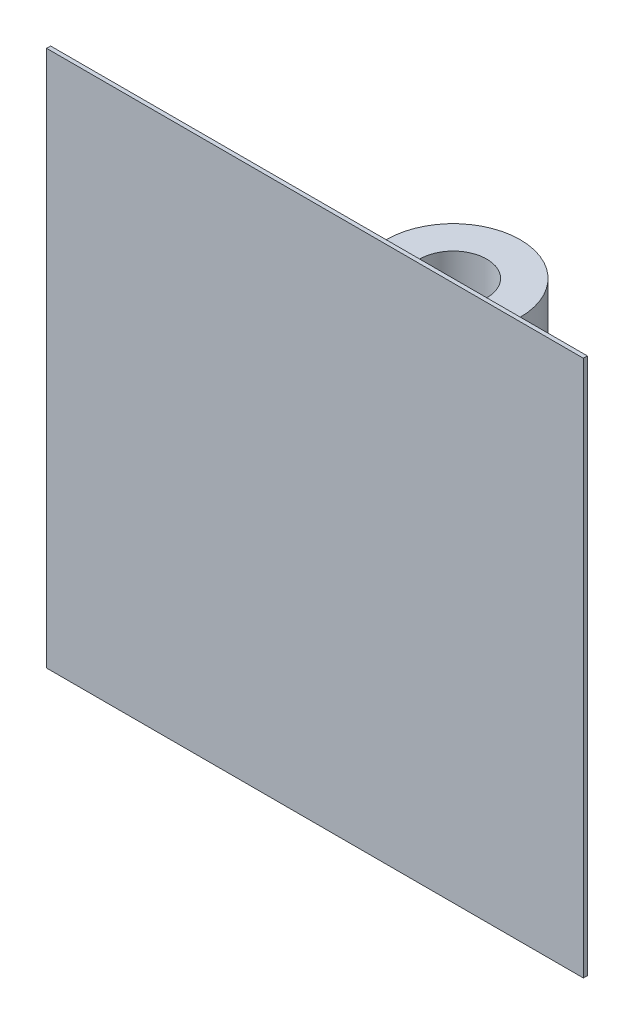
ISO-10303-21;
HEADER;
FILE_DESCRIPTION(('STEP AP214'),'2;1');
FILE_NAME('part.step','',(''),(''),'','','');
FILE_SCHEMA(('AUTOMOTIVE_DESIGN { 1 0 10303 214 1 1 1 1 }'));
ENDSEC;
DATA;
#1=APPLICATION_CONTEXT('core data for automotive mechanical design processes');
#2=APPLICATION_PROTOCOL_DEFINITION('international standard','automotive_design',2000,#1);
#3=PRODUCT_CONTEXT('',#1,'mechanical');
#4=PRODUCT('Part','Part','',(#3));
#5=PRODUCT_RELATED_PRODUCT_CATEGORY('part','',(#4));
#6=PRODUCT_DEFINITION_FORMATION('','',#4);
#7=PRODUCT_DEFINITION_CONTEXT('part definition',#1,'design');
#8=PRODUCT_DEFINITION('design','',#6,#7);
#9=PRODUCT_DEFINITION_SHAPE('','',#8);
#10=(LENGTH_UNIT() NAMED_UNIT(*) SI_UNIT(.MILLI.,.METRE.));
#11=(NAMED_UNIT(*) PLANE_ANGLE_UNIT() SI_UNIT($,.RADIAN.));
#12=(NAMED_UNIT(*) SI_UNIT($,.STERADIAN.) SOLID_ANGLE_UNIT());
#13=UNCERTAINTY_MEASURE_WITH_UNIT(LENGTH_MEASURE(1.E-05),#10,'distance_accuracy_value','');
#14=(GEOMETRIC_REPRESENTATION_CONTEXT(3) GLOBAL_UNCERTAINTY_ASSIGNED_CONTEXT((#13)) GLOBAL_UNIT_ASSIGNED_CONTEXT((#10,
#11,#12)) REPRESENTATION_CONTEXT('',''));
#15=CARTESIAN_POINT('',(0.,0.,0.));
#16=DIRECTION('',(0.,0.,1.));
#17=DIRECTION('',(1.,0.,0.));
#18=AXIS2_PLACEMENT_3D('',#15,#16,#17);
#19=CARTESIAN_POINT('',(0.,-10.,-10.));
#20=DIRECTION('',(0.,1.,0.));
#21=DIRECTION('',(0.,0.,1.));
#22=AXIS2_PLACEMENT_3D('',#19,#20,#21);
#23=CYLINDRICAL_SURFACE('',#22,5.);
#24=DIRECTION('',(0.,1.,0.));
#25=VECTOR('',#24,1.);
#26=CARTESIAN_POINT('',(-5.,-10.,-10.));
#27=LINE('',#26,#25);
#28=CARTESIAN_POINT('',(-5.,-10.,-10.));
#29=VERTEX_POINT('',#28);
#30=CARTESIAN_POINT('',(-5.,-2.5,-10.));
#31=VERTEX_POINT('',#30);
#32=EDGE_CURVE('E195',#29,#31,#27,.T.);
#33=ORIENTED_EDGE('',*,*,#32,.T.);
#34=CARTESIAN_POINT('',(0.,-2.5,-10.));
#35=DIRECTION('',(0.,1.,0.));
#36=DIRECTION('',(0.,0.,1.));
#37=AXIS2_PLACEMENT_3D('',#34,#35,#36);
#38=CIRCLE('',#37,5.);
#39=CARTESIAN_POINT('',(5.,-2.5,-10.));
#40=VERTEX_POINT('',#39);
#41=EDGE_CURVE('E49',#31,#40,#38,.F.);
#42=ORIENTED_EDGE('',*,*,#41,.T.);
#43=DIRECTION('',(0.,1.,0.));
#44=VECTOR('',#43,1.);
#45=CARTESIAN_POINT('',(5.,-10.,-10.));
#46=LINE('',#45,#44);
#47=CARTESIAN_POINT('',(5.,-10.,-10.));
#48=VERTEX_POINT('',#47);
#49=EDGE_CURVE('E185',#48,#40,#46,.T.);
#50=ORIENTED_EDGE('',*,*,#49,.F.);
#51=CARTESIAN_POINT('',(0.,-10.,-10.));
#52=DIRECTION('',(0.,1.,0.));
#53=DIRECTION('',(0.,0.,1.));
#54=AXIS2_PLACEMENT_3D('',#51,#52,#53);
#55=CIRCLE('',#54,5.);
#56=EDGE_CURVE('E173',#48,#29,#55,.T.);
#57=ORIENTED_EDGE('',*,*,#56,.T.);
#58=EDGE_LOOP('',(#33,#42,#50,#57));
#59=FACE_BOUND('',#58,.T.);
#60=ADVANCED_FACE('F34',(#59),#23,.T.);
#61=CARTESIAN_POINT('',(0.,-10.,-10.));
#62=DIRECTION('',(0.,1.,0.));
#63=DIRECTION('',(0.,0.,1.));
#64=AXIS2_PLACEMENT_3D('',#61,#62,#63);
#65=CYLINDRICAL_SURFACE('',#64,2.5);
#66=CARTESIAN_POINT('',(0.,-10.,-10.));
#67=DIRECTION('',(0.,1.,0.));
#68=DIRECTION('',(0.,0.,1.));
#69=AXIS2_PLACEMENT_3D('',#66,#67,#68);
#70=CIRCLE('',#69,2.5);
#71=CARTESIAN_POINT('',(0.,-10.,-7.5));
#72=VERTEX_POINT('',#71);
#73=EDGE_CURVE('E170',#72,#72,#70,.T.);
#74=ORIENTED_EDGE('',*,*,#73,.F.);
#75=EDGE_LOOP('',(#74));
#76=FACE_BOUND('',#75,.T.);
#77=CARTESIAN_POINT('',(0.,-2.5,-10.));
#78=DIRECTION('',(0.,1.,0.));
#79=DIRECTION('',(0.,0.,1.));
#80=AXIS2_PLACEMENT_3D('',#77,#78,#79);
#81=CIRCLE('',#80,2.5);
#82=CARTESIAN_POINT('',(0.,-2.5,-7.5));
#83=VERTEX_POINT('',#82);
#84=EDGE_CURVE('E130',#83,#83,#81,.F.);
#85=ORIENTED_EDGE('',*,*,#84,.F.);
#86=EDGE_LOOP('',(#85));
#87=FACE_BOUND('',#86,.T.);
#88=ADVANCED_FACE('F260',(#76,#87),#65,.F.);
#89=CARTESIAN_POINT('',(0.,0.,0.));
#90=DIRECTION('',(0.,0.,1.));
#91=DIRECTION('',(1.,0.,0.));
#92=AXIS2_PLACEMENT_3D('',#89,#90,#91);
#93=PLANE('',#92);
#94=DIRECTION('',(0.,-1.,0.));
#95=VECTOR('',#94,1.);
#96=CARTESIAN_POINT('',(-20.,20.,0.));
#97=LINE('',#96,#95);
#98=CARTESIAN_POINT('',(-20.,20.,0.));
#99=VERTEX_POINT('',#98);
#100=CARTESIAN_POINT('',(-20.,-20.,0.));
#101=VERTEX_POINT('',#100);
#102=EDGE_CURVE('E188',#99,#101,#97,.T.);
#103=ORIENTED_EDGE('',*,*,#102,.F.);
#104=DIRECTION('',(1.,0.,0.));
#105=VECTOR('',#104,1.);
#106=CARTESIAN_POINT('',(-20.,20.,0.));
#107=LINE('',#106,#105);
#108=CARTESIAN_POINT('',(20.,20.,0.));
#109=VERTEX_POINT('',#108);
#110=EDGE_CURVE('E201',#99,#109,#107,.T.);
#111=ORIENTED_EDGE('',*,*,#110,.T.);
#112=DIRECTION('',(0.,-1.,0.));
#113=VECTOR('',#112,1.);
#114=CARTESIAN_POINT('',(20.,20.,0.));
#115=LINE('',#114,#113);
#116=CARTESIAN_POINT('',(20.,-20.,0.));
#117=VERTEX_POINT('',#116);
#118=EDGE_CURVE('E215',#109,#117,#115,.T.);
#119=ORIENTED_EDGE('',*,*,#118,.T.);
#120=DIRECTION('',(1.,0.,0.));
#121=VECTOR('',#120,1.);
#122=CARTESIAN_POINT('',(-20.,-20.,0.));
#123=LINE('',#122,#121);
#124=EDGE_CURVE('E212',#101,#117,#123,.T.);
#125=ORIENTED_EDGE('',*,*,#124,.F.);
#126=EDGE_LOOP('',(#103,#111,#119,#125));
#127=FACE_BOUND('',#126,.T.);
#128=DIRECTION('',(1.,0.,0.));
#129=VECTOR('',#128,1.);
#130=CARTESIAN_POINT('',(-5.,-10.,0.));
#131=LINE('',#130,#129);
#132=CARTESIAN_POINT('',(-5.,-10.,0.));
#133=VERTEX_POINT('',#132);
#134=CARTESIAN_POINT('',(5.,-10.,0.));
#135=VERTEX_POINT('',#134);
#136=EDGE_CURVE('E179',#133,#135,#131,.T.);
#137=ORIENTED_EDGE('',*,*,#136,.T.);
#138=DIRECTION('',(0.,1.,0.));
#139=VECTOR('',#138,1.);
#140=CARTESIAN_POINT('',(5.,-10.,0.));
#141=LINE('',#140,#139);
#142=CARTESIAN_POINT('',(5.,10.,0.));
#143=VERTEX_POINT('',#142);
#144=EDGE_CURVE('E190',#135,#143,#141,.T.);
#145=ORIENTED_EDGE('',*,*,#144,.T.);
#146=DIRECTION('',(1.,0.,0.));
#147=VECTOR('',#146,1.);
#148=CARTESIAN_POINT('',(-5.,10.,0.));
#149=LINE('',#148,#147);
#150=CARTESIAN_POINT('',(-5.,10.,0.));
#151=VERTEX_POINT('',#150);
#152=EDGE_CURVE('E165',#151,#143,#149,.T.);
#153=ORIENTED_EDGE('',*,*,#152,.F.);
#154=DIRECTION('',(0.,1.,0.));
#155=VECTOR('',#154,1.);
#156=CARTESIAN_POINT('',(-5.,-10.,0.));
#157=LINE('',#156,#155);
#158=EDGE_CURVE('E193',#133,#151,#157,.T.);
#159=ORIENTED_EDGE('',*,*,#158,.F.);
#160=EDGE_LOOP('',(#137,#145,#153,#159));
#161=FACE_BOUND('',#160,.T.);
#162=ADVANCED_FACE('F242',(#127,#161),#93,.F.);
#163=CARTESIAN_POINT('',(-20.,20.,0.3));
#164=DIRECTION('',(1.,0.,0.));
#165=DIRECTION('',(0.,1.,0.));
#166=AXIS2_PLACEMENT_3D('',#163,#164,#165);
#167=PLANE('',#166);
#168=ORIENTED_EDGE('',*,*,#102,.T.);
#169=DIRECTION('',(0.,0.,-1.));
#170=VECTOR('',#169,1.);
#171=CARTESIAN_POINT('',(-20.,-20.,0.3));
#172=LINE('',#171,#170);
#173=CARTESIAN_POINT('',(-20.,-20.,0.3));
#174=VERTEX_POINT('',#173);
#175=EDGE_CURVE('E42',#174,#101,#172,.T.);
#176=ORIENTED_EDGE('',*,*,#175,.F.);
#177=DIRECTION('',(0.,-1.,0.));
#178=VECTOR('',#177,1.);
#179=CARTESIAN_POINT('',(-20.,20.,0.3));
#180=LINE('',#179,#178);
#181=CARTESIAN_POINT('',(-20.,20.,0.3));
#182=VERTEX_POINT('',#181);
#183=EDGE_CURVE('E197',#182,#174,#180,.T.);
#184=ORIENTED_EDGE('',*,*,#183,.F.);
#185=DIRECTION('',(0.,0.,-1.));
#186=VECTOR('',#185,1.);
#187=CARTESIAN_POINT('',(-20.,20.,0.3));
#188=LINE('',#187,#186);
#189=EDGE_CURVE('E209',#182,#99,#188,.T.);
#190=ORIENTED_EDGE('',*,*,#189,.T.);
#191=EDGE_LOOP('',(#168,#176,#184,#190));
#192=FACE_BOUND('',#191,.T.);
#193=ADVANCED_FACE('F36',(#192),#167,.F.);
#194=CARTESIAN_POINT('',(-20.,-20.,0.3));
#195=DIRECTION('',(0.,1.,0.));
#196=DIRECTION('',(0.,0.,1.));
#197=AXIS2_PLACEMENT_3D('',#194,#195,#196);
#198=PLANE('',#197);
#199=ORIENTED_EDGE('',*,*,#124,.T.);
#200=DIRECTION('',(0.,0.,-1.));
#201=VECTOR('',#200,1.);
#202=CARTESIAN_POINT('',(20.,-20.,0.3));
#203=LINE('',#202,#201);
#204=CARTESIAN_POINT('',(20.,-20.,0.3));
#205=VERTEX_POINT('',#204);
#206=EDGE_CURVE('E223',#205,#117,#203,.T.);
#207=ORIENTED_EDGE('',*,*,#206,.F.);
#208=DIRECTION('',(1.,0.,0.));
#209=VECTOR('',#208,1.);
#210=CARTESIAN_POINT('',(-20.,-20.,0.3));
#211=LINE('',#210,#209);
#212=EDGE_CURVE('E200',#174,#205,#211,.T.);
#213=ORIENTED_EDGE('',*,*,#212,.F.);
#214=ORIENTED_EDGE('',*,*,#175,.T.);
#215=EDGE_LOOP('',(#199,#207,#213,#214));
#216=FACE_BOUND('',#215,.T.);
#217=ADVANCED_FACE('F295',(#216),#198,.F.);
#218=CARTESIAN_POINT('',(20.,20.,0.3));
#219=DIRECTION('',(1.,0.,0.));
#220=DIRECTION('',(0.,1.,0.));
#221=AXIS2_PLACEMENT_3D('',#218,#219,#220);
#222=PLANE('',#221);
#223=ORIENTED_EDGE('',*,*,#118,.F.);
#224=DIRECTION('',(0.,0.,-1.));
#225=VECTOR('',#224,1.);
#226=CARTESIAN_POINT('',(20.,20.,0.3));
#227=LINE('',#226,#225);
#228=CARTESIAN_POINT('',(20.,20.,0.3));
#229=VERTEX_POINT('',#228);
#230=EDGE_CURVE('E221',#229,#109,#227,.T.);
#231=ORIENTED_EDGE('',*,*,#230,.F.);
#232=DIRECTION('',(0.,-1.,0.));
#233=VECTOR('',#232,1.);
#234=CARTESIAN_POINT('',(20.,20.,0.3));
#235=LINE('',#234,#233);
#236=EDGE_CURVE('E203',#229,#205,#235,.T.);
#237=ORIENTED_EDGE('',*,*,#236,.T.);
#238=ORIENTED_EDGE('',*,*,#206,.T.);
#239=EDGE_LOOP('',(#223,#231,#237,#238));
#240=FACE_BOUND('',#239,.T.);
#241=ADVANCED_FACE('F287',(#240),#222,.T.);
#242=CARTESIAN_POINT('',(-20.,20.,0.3));
#243=DIRECTION('',(0.,1.,0.));
#244=DIRECTION('',(0.,0.,1.));
#245=AXIS2_PLACEMENT_3D('',#242,#243,#244);
#246=PLANE('',#245);
#247=ORIENTED_EDGE('',*,*,#110,.F.);
#248=ORIENTED_EDGE('',*,*,#189,.F.);
#249=DIRECTION('',(1.,0.,0.));
#250=VECTOR('',#249,1.);
#251=CARTESIAN_POINT('',(-20.,20.,0.3));
#252=LINE('',#251,#250);
#253=EDGE_CURVE('E206',#182,#229,#252,.T.);
#254=ORIENTED_EDGE('',*,*,#253,.T.);
#255=ORIENTED_EDGE('',*,*,#230,.T.);
#256=EDGE_LOOP('',(#247,#248,#254,#255));
#257=FACE_BOUND('',#256,.T.);
#258=ADVANCED_FACE('F282',(#257),#246,.T.);
#259=CARTESIAN_POINT('',(0.,0.,0.3));
#260=DIRECTION('',(0.,0.,1.));
#261=DIRECTION('',(1.,0.,0.));
#262=AXIS2_PLACEMENT_3D('',#259,#260,#261);
#263=PLANE('',#262);
#264=ORIENTED_EDGE('',*,*,#183,.T.);
#265=ORIENTED_EDGE('',*,*,#212,.T.);
#266=ORIENTED_EDGE('',*,*,#236,.F.);
#267=ORIENTED_EDGE('',*,*,#253,.F.);
#268=EDGE_LOOP('',(#264,#265,#266,#267));
#269=FACE_BOUND('',#268,.T.);
#270=ADVANCED_FACE('F276',(#269),#263,.T.);
#271=CARTESIAN_POINT('',(0.,2.5,-10.));
#272=DIRECTION('',(0.,1.,0.));
#273=DIRECTION('',(0.,0.,1.));
#274=AXIS2_PLACEMENT_3D('',#271,#272,#273);
#275=CIRCLE('',#274,5.);
#276=CARTESIAN_POINT('',(-5.,2.5,-10.));
#277=VERTEX_POINT('',#276);
#278=CARTESIAN_POINT('',(5.,2.5,-10.));
#279=VERTEX_POINT('',#278);
#280=EDGE_CURVE('E147',#277,#279,#275,.F.);
#281=ORIENTED_EDGE('',*,*,#280,.F.);
#282=CARTESIAN_POINT('',(-5.,10.,-10.));
#283=VERTEX_POINT('',#282);
#284=EDGE_CURVE('E144',#277,#283,#27,.T.);
#285=ORIENTED_EDGE('',*,*,#284,.T.);
#286=CARTESIAN_POINT('',(0.,10.,-10.));
#287=DIRECTION('',(0.,1.,0.));
#288=DIRECTION('',(0.,0.,1.));
#289=AXIS2_PLACEMENT_3D('',#286,#287,#288);
#290=CIRCLE('',#289,5.);
#291=CARTESIAN_POINT('',(5.,10.,-10.));
#292=VERTEX_POINT('',#291);
#293=EDGE_CURVE('E162',#292,#283,#290,.T.);
#294=ORIENTED_EDGE('',*,*,#293,.F.);
#295=EDGE_CURVE('E189',#279,#292,#46,.T.);
#296=ORIENTED_EDGE('',*,*,#295,.F.);
#297=EDGE_LOOP('',(#281,#285,#294,#296));
#298=FACE_BOUND('',#297,.T.);
#299=ADVANCED_FACE('F249',(#298),#23,.T.);
#300=CARTESIAN_POINT('',(5.,-10.,-10.));
#301=DIRECTION('',(1.,0.,0.));
#302=DIRECTION('',(0.,0.,-1.));
#303=AXIS2_PLACEMENT_3D('',#300,#301,#302);
#304=PLANE('',#303);
#305=DIRECTION('',(0.,0.,1.));
#306=VECTOR('',#305,1.);
#307=CARTESIAN_POINT('',(5.,2.5,-10.));
#308=LINE('',#307,#306);
#309=CARTESIAN_POINT('',(5.,2.5,-4.));
#310=VERTEX_POINT('',#309);
#311=EDGE_CURVE('E150',#279,#310,#308,.T.);
#312=ORIENTED_EDGE('',*,*,#311,.F.);
#313=ORIENTED_EDGE('',*,*,#295,.T.);
#314=DIRECTION('',(0.,0.,-1.));
#315=VECTOR('',#314,1.);
#316=CARTESIAN_POINT('',(5.,10.,-10.));
#317=LINE('',#316,#315);
#318=EDGE_CURVE('E167',#143,#292,#317,.T.);
#319=ORIENTED_EDGE('',*,*,#318,.F.);
#320=ORIENTED_EDGE('',*,*,#144,.F.);
#321=DIRECTION('',(0.,0.,-1.));
#322=VECTOR('',#321,1.);
#323=CARTESIAN_POINT('',(5.,-10.,-10.));
#324=LINE('',#323,#322);
#325=EDGE_CURVE('E182',#135,#48,#324,.T.);
#326=ORIENTED_EDGE('',*,*,#325,.T.);
#327=ORIENTED_EDGE('',*,*,#49,.T.);
#328=DIRECTION('',(0.,0.,1.));
#329=VECTOR('',#328,1.);
#330=CARTESIAN_POINT('',(5.,-2.5,-10.));
#331=LINE('',#330,#329);
#332=CARTESIAN_POINT('',(5.,-2.5,-4.));
#333=VERTEX_POINT('',#332);
#334=EDGE_CURVE('E153',#40,#333,#331,.T.);
#335=ORIENTED_EDGE('',*,*,#334,.T.);
#336=DIRECTION('',(0.,1.,0.));
#337=VECTOR('',#336,1.);
#338=CARTESIAN_POINT('',(5.,-10.,-4.));
#339=LINE('',#338,#337);
#340=EDGE_CURVE('E137',#333,#310,#339,.T.);
#341=ORIENTED_EDGE('',*,*,#340,.T.);
#342=EDGE_LOOP('',(#312,#313,#319,#320,#326,#327,#335,#341));
#343=FACE_BOUND('',#342,.T.);
#344=ADVANCED_FACE('F233',(#343),#304,.T.);
#345=CARTESIAN_POINT('',(-5.,-10.,-10.));
#346=DIRECTION('',(-1.,0.,0.));
#347=DIRECTION('',(0.,0.,1.));
#348=AXIS2_PLACEMENT_3D('',#345,#346,#347);
#349=PLANE('',#348);
#350=DIRECTION('',(0.,0.,-1.));
#351=VECTOR('',#350,1.);
#352=CARTESIAN_POINT('',(-5.,2.5,-10.));
#353=LINE('',#352,#351);
#354=CARTESIAN_POINT('',(-5.,2.5,-4.));
#355=VERTEX_POINT('',#354);
#356=EDGE_CURVE('E143',#355,#277,#353,.T.);
#357=ORIENTED_EDGE('',*,*,#356,.F.);
#358=DIRECTION('',(0.,-1.,0.));
#359=VECTOR('',#358,1.);
#360=CARTESIAN_POINT('',(-5.,-10.,-4.));
#361=LINE('',#360,#359);
#362=CARTESIAN_POINT('',(-5.,-2.5,-4.));
#363=VERTEX_POINT('',#362);
#364=EDGE_CURVE('E11',#355,#363,#361,.T.);
#365=ORIENTED_EDGE('',*,*,#364,.T.);
#366=DIRECTION('',(0.,0.,-1.));
#367=VECTOR('',#366,1.);
#368=CARTESIAN_POINT('',(-5.,-2.5,-10.));
#369=LINE('',#368,#367);
#370=EDGE_CURVE('E122',#363,#31,#369,.T.);
#371=ORIENTED_EDGE('',*,*,#370,.T.);
#372=ORIENTED_EDGE('',*,*,#32,.F.);
#373=DIRECTION('',(0.,0.,1.));
#374=VECTOR('',#373,1.);
#375=CARTESIAN_POINT('',(-5.,-10.,-10.));
#376=LINE('',#375,#374);
#377=EDGE_CURVE('E176',#29,#133,#376,.T.);
#378=ORIENTED_EDGE('',*,*,#377,.T.);
#379=ORIENTED_EDGE('',*,*,#158,.T.);
#380=DIRECTION('',(0.,0.,1.));
#381=VECTOR('',#380,1.);
#382=CARTESIAN_POINT('',(-5.,10.,-10.));
#383=LINE('',#382,#381);
#384=EDGE_CURVE('E57',#283,#151,#383,.T.);
#385=ORIENTED_EDGE('',*,*,#384,.F.);
#386=ORIENTED_EDGE('',*,*,#284,.F.);
#387=EDGE_LOOP('',(#357,#365,#371,#372,#378,#379,#385,#386));
#388=FACE_BOUND('',#387,.T.);
#389=ADVANCED_FACE('F141',(#388),#349,.T.);
#390=CARTESIAN_POINT('',(0.,-10.,-10.));
#391=DIRECTION('',(0.,1.,0.));
#392=DIRECTION('',(0.,0.,1.));
#393=AXIS2_PLACEMENT_3D('',#390,#391,#392);
#394=PLANE('',#393);
#395=ORIENTED_EDGE('',*,*,#73,.T.);
#396=EDGE_LOOP('',(#395));
#397=FACE_BOUND('',#396,.T.);
#398=ORIENTED_EDGE('',*,*,#56,.F.);
#399=ORIENTED_EDGE('',*,*,#325,.F.);
#400=ORIENTED_EDGE('',*,*,#136,.F.);
#401=ORIENTED_EDGE('',*,*,#377,.F.);
#402=EDGE_LOOP('',(#398,#399,#400,#401));
#403=FACE_BOUND('',#402,.T.);
#404=ADVANCED_FACE('F238',(#397,#403),#394,.F.);
#405=CARTESIAN_POINT('',(0.,2.5,-10.));
#406=DIRECTION('',(0.,1.,0.));
#407=DIRECTION('',(0.,0.,1.));
#408=AXIS2_PLACEMENT_3D('',#405,#406,#407);
#409=CIRCLE('',#408,2.5);
#410=CARTESIAN_POINT('',(0.,2.5,-7.5));
#411=VERTEX_POINT('',#410);
#412=EDGE_CURVE('E148',#411,#411,#409,.F.);
#413=ORIENTED_EDGE('',*,*,#412,.T.);
#414=EDGE_LOOP('',(#413));
#415=FACE_BOUND('',#414,.T.);
#416=CARTESIAN_POINT('',(0.,10.,-10.));
#417=DIRECTION('',(0.,1.,0.));
#418=DIRECTION('',(0.,0.,1.));
#419=AXIS2_PLACEMENT_3D('',#416,#417,#418);
#420=CIRCLE('',#419,2.5);
#421=CARTESIAN_POINT('',(0.,10.,-7.5));
#422=VERTEX_POINT('',#421);
#423=EDGE_CURVE('E159',#422,#422,#420,.T.);
#424=ORIENTED_EDGE('',*,*,#423,.T.);
#425=EDGE_LOOP('',(#424));
#426=FACE_BOUND('',#425,.T.);
#427=ADVANCED_FACE('F256',(#415,#426),#65,.F.);
#428=CARTESIAN_POINT('',(0.,10.,-10.));
#429=DIRECTION('',(0.,1.,0.));
#430=DIRECTION('',(0.,0.,1.));
#431=AXIS2_PLACEMENT_3D('',#428,#429,#430);
#432=PLANE('',#431);
#433=ORIENTED_EDGE('',*,*,#293,.T.);
#434=ORIENTED_EDGE('',*,*,#384,.T.);
#435=ORIENTED_EDGE('',*,*,#152,.T.);
#436=ORIENTED_EDGE('',*,*,#318,.T.);
#437=EDGE_LOOP('',(#433,#434,#435,#436));
#438=FACE_BOUND('',#437,.T.);
#439=ORIENTED_EDGE('',*,*,#423,.F.);
#440=EDGE_LOOP('',(#439));
#441=FACE_BOUND('',#440,.T.);
#442=ADVANCED_FACE('F244',(#438,#441),#432,.T.);
#443=CARTESIAN_POINT('',(0.,2.5,0.));
#444=DIRECTION('',(0.,1.,0.));
#445=DIRECTION('',(0.,0.,1.));
#446=AXIS2_PLACEMENT_3D('',#443,#444,#445);
#447=PLANE('',#446);
#448=ORIENTED_EDGE('',*,*,#311,.T.);
#449=DIRECTION('',(1.,0.,0.));
#450=VECTOR('',#449,1.);
#451=CARTESIAN_POINT('',(-7.02807757222276,2.5,-4.));
#452=LINE('',#451,#450);
#453=EDGE_CURVE('E138',#355,#310,#452,.T.);
#454=ORIENTED_EDGE('',*,*,#453,.F.);
#455=ORIENTED_EDGE('',*,*,#356,.T.);
#456=ORIENTED_EDGE('',*,*,#280,.T.);
#457=EDGE_LOOP('',(#448,#454,#455,#456));
#458=FACE_BOUND('',#457,.T.);
#459=ORIENTED_EDGE('',*,*,#412,.F.);
#460=EDGE_LOOP('',(#459));
#461=FACE_BOUND('',#460,.T.);
#462=ADVANCED_FACE('F250',(#458,#461),#447,.F.);
#463=CARTESIAN_POINT('',(0.,-2.5,0.));
#464=DIRECTION('',(0.,1.,0.));
#465=DIRECTION('',(0.,0.,1.));
#466=AXIS2_PLACEMENT_3D('',#463,#464,#465);
#467=PLANE('',#466);
#468=ORIENTED_EDGE('',*,*,#41,.F.);
#469=ORIENTED_EDGE('',*,*,#370,.F.);
#470=DIRECTION('',(1.,0.,0.));
#471=VECTOR('',#470,1.);
#472=CARTESIAN_POINT('',(-7.02807757222276,-2.5,-4.));
#473=LINE('',#472,#471);
#474=EDGE_CURVE('E126',#363,#333,#473,.T.);
#475=ORIENTED_EDGE('',*,*,#474,.T.);
#476=ORIENTED_EDGE('',*,*,#334,.F.);
#477=EDGE_LOOP('',(#468,#469,#475,#476));
#478=FACE_BOUND('',#477,.T.);
#479=ORIENTED_EDGE('',*,*,#84,.T.);
#480=EDGE_LOOP('',(#479));
#481=FACE_BOUND('',#480,.T.);
#482=ADVANCED_FACE('F124',(#478,#481),#467,.T.);
#483=CARTESIAN_POINT('',(-7.02807757222276,2.5,-4.));
#484=DIRECTION('',(0.,0.,-1.));
#485=DIRECTION('',(-1.,0.,0.));
#486=AXIS2_PLACEMENT_3D('',#483,#484,#485);
#487=PLANE('',#486);
#488=ORIENTED_EDGE('',*,*,#474,.F.);
#489=ORIENTED_EDGE('',*,*,#364,.F.);
#490=ORIENTED_EDGE('',*,*,#453,.T.);
#491=ORIENTED_EDGE('',*,*,#340,.F.);
#492=EDGE_LOOP('',(#488,#489,#490,#491));
#493=FACE_BOUND('',#492,.T.);
#494=ADVANCED_FACE('F133',(#493),#487,.T.);
#495=CLOSED_SHELL('',(#60,#88,#162,#193,#217,#241,#258,#270,#299,#344,#389,#404,#427,#442,#462,
#482,#494));
#496=MANIFOLD_SOLID_BREP('B2',#495);
#497=ADVANCED_BREP_SHAPE_REPRESENTATION('',(#18,#496),#14);
#498=SHAPE_DEFINITION_REPRESENTATION(#9,#497);
ENDSEC;
END-ISO-10303-21;
